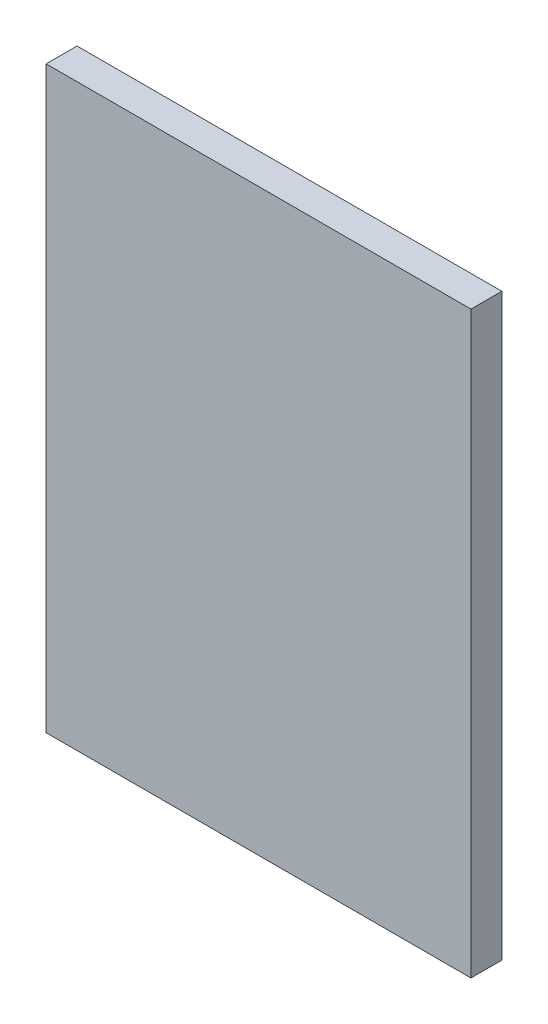
ISO-10303-21;
HEADER;
FILE_DESCRIPTION(('STEP AP214'),'2;1');
FILE_NAME('part.step','',(''),(''),'','','');
FILE_SCHEMA(('AUTOMOTIVE_DESIGN { 1 0 10303 214 1 1 1 1 }'));
ENDSEC;
DATA;
#1=APPLICATION_CONTEXT('core data for automotive mechanical design processes');
#2=APPLICATION_PROTOCOL_DEFINITION('international standard','automotive_design',2000,#1);
#3=PRODUCT_CONTEXT('',#1,'mechanical');
#4=PRODUCT('Part','Part','',(#3));
#5=PRODUCT_RELATED_PRODUCT_CATEGORY('part','',(#4));
#6=PRODUCT_DEFINITION_FORMATION('','',#4);
#7=PRODUCT_DEFINITION_CONTEXT('part definition',#1,'design');
#8=PRODUCT_DEFINITION('design','',#6,#7);
#9=PRODUCT_DEFINITION_SHAPE('','',#8);
#10=(LENGTH_UNIT() NAMED_UNIT(*) SI_UNIT(.MILLI.,.METRE.));
#11=(NAMED_UNIT(*) PLANE_ANGLE_UNIT() SI_UNIT($,.RADIAN.));
#12=(NAMED_UNIT(*) SI_UNIT($,.STERADIAN.) SOLID_ANGLE_UNIT());
#13=UNCERTAINTY_MEASURE_WITH_UNIT(LENGTH_MEASURE(1.E-05),#10,'distance_accuracy_value','');
#14=(GEOMETRIC_REPRESENTATION_CONTEXT(3) GLOBAL_UNCERTAINTY_ASSIGNED_CONTEXT((#13)) GLOBAL_UNIT_ASSIGNED_CONTEXT((#10,
#11,#12)) REPRESENTATION_CONTEXT('',''));
#15=CARTESIAN_POINT('',(0.,0.,0.));
#16=DIRECTION('',(0.,0.,1.));
#17=DIRECTION('',(1.,0.,0.));
#18=AXIS2_PLACEMENT_3D('',#15,#16,#17);
#19=CARTESIAN_POINT('',(0.,0.,8.));
#20=DIRECTION('',(1.,0.,0.));
#21=DIRECTION('',(0.,0.,-1.));
#22=AXIS2_PLACEMENT_3D('',#19,#20,#21);
#23=PLANE('',#22);
#24=DIRECTION('',(0.,-1.,0.));
#25=VECTOR('',#24,1.);
#26=CARTESIAN_POINT('',(0.,0.,0.));
#27=LINE('',#26,#25);
#28=CARTESIAN_POINT('',(0.,150.,0.));
#29=VERTEX_POINT('',#28);
#30=CARTESIAN_POINT('',(0.,0.,0.));
#31=VERTEX_POINT('',#30);
#32=EDGE_CURVE('E98',#29,#31,#27,.T.);
#33=ORIENTED_EDGE('',*,*,#32,.T.);
#34=DIRECTION('',(0.,0.,-1.));
#35=VECTOR('',#34,1.);
#36=CARTESIAN_POINT('',(0.,0.,8.));
#37=LINE('',#36,#35);
#38=CARTESIAN_POINT('',(0.,0.,8.));
#39=VERTEX_POINT('',#38);
#40=EDGE_CURVE('E11',#39,#31,#37,.T.);
#41=ORIENTED_EDGE('',*,*,#40,.F.);
#42=DIRECTION('',(0.,-1.,0.));
#43=VECTOR('',#42,1.);
#44=CARTESIAN_POINT('',(0.,0.,8.));
#45=LINE('',#44,#43);
#46=CARTESIAN_POINT('',(0.,150.,8.));
#47=VERTEX_POINT('',#46);
#48=EDGE_CURVE('E86',#47,#39,#45,.T.);
#49=ORIENTED_EDGE('',*,*,#48,.F.);
#50=DIRECTION('',(0.,0.,-1.));
#51=VECTOR('',#50,1.);
#52=CARTESIAN_POINT('',(0.,150.,8.));
#53=LINE('',#52,#51);
#54=EDGE_CURVE('E94',#47,#29,#53,.T.);
#55=ORIENTED_EDGE('',*,*,#54,.T.);
#56=EDGE_LOOP('',(#33,#41,#49,#55));
#57=FACE_BOUND('',#56,.T.);
#58=ADVANCED_FACE('F35',(#57),#23,.F.);
#59=CARTESIAN_POINT('',(0.,0.,8.));
#60=DIRECTION('',(0.,1.,0.));
#61=DIRECTION('',(0.,0.,1.));
#62=AXIS2_PLACEMENT_3D('',#59,#60,#61);
#63=PLANE('',#62);
#64=DIRECTION('',(1.,0.,0.));
#65=VECTOR('',#64,1.);
#66=CARTESIAN_POINT('',(0.,0.,0.));
#67=LINE('',#66,#65);
#68=CARTESIAN_POINT('',(110.,0.,0.));
#69=VERTEX_POINT('',#68);
#70=EDGE_CURVE('E90',#31,#69,#67,.T.);
#71=ORIENTED_EDGE('',*,*,#70,.T.);
#72=DIRECTION('',(0.,0.,-1.));
#73=VECTOR('',#72,1.);
#74=CARTESIAN_POINT('',(110.,0.,8.));
#75=LINE('',#74,#73);
#76=CARTESIAN_POINT('',(110.,0.,8.));
#77=VERTEX_POINT('',#76);
#78=EDGE_CURVE('E43',#77,#69,#75,.T.);
#79=ORIENTED_EDGE('',*,*,#78,.F.);
#80=DIRECTION('',(1.,0.,0.));
#81=VECTOR('',#80,1.);
#82=CARTESIAN_POINT('',(0.,0.,8.));
#83=LINE('',#82,#81);
#84=EDGE_CURVE('E81',#39,#77,#83,.T.);
#85=ORIENTED_EDGE('',*,*,#84,.F.);
#86=ORIENTED_EDGE('',*,*,#40,.T.);
#87=EDGE_LOOP('',(#71,#79,#85,#86));
#88=FACE_BOUND('',#87,.T.);
#89=ADVANCED_FACE('F89',(#88),#63,.F.);
#90=CARTESIAN_POINT('',(110.,0.,8.));
#91=DIRECTION('',(-1.,0.,0.));
#92=DIRECTION('',(0.,0.,1.));
#93=AXIS2_PLACEMENT_3D('',#90,#91,#92);
#94=PLANE('',#93);
#95=DIRECTION('',(0.,1.,0.));
#96=VECTOR('',#95,1.);
#97=CARTESIAN_POINT('',(110.,0.,0.));
#98=LINE('',#97,#96);
#99=CARTESIAN_POINT('',(110.,150.,0.));
#100=VERTEX_POINT('',#99);
#101=EDGE_CURVE('E68',#69,#100,#98,.T.);
#102=ORIENTED_EDGE('',*,*,#101,.T.);
#103=DIRECTION('',(0.,0.,-1.));
#104=VECTOR('',#103,1.);
#105=CARTESIAN_POINT('',(110.,150.,8.));
#106=LINE('',#105,#104);
#107=CARTESIAN_POINT('',(110.,150.,8.));
#108=VERTEX_POINT('',#107);
#109=EDGE_CURVE('E91',#108,#100,#106,.T.);
#110=ORIENTED_EDGE('',*,*,#109,.F.);
#111=DIRECTION('',(0.,1.,0.));
#112=VECTOR('',#111,1.);
#113=CARTESIAN_POINT('',(110.,0.,8.));
#114=LINE('',#113,#112);
#115=EDGE_CURVE('E84',#77,#108,#114,.T.);
#116=ORIENTED_EDGE('',*,*,#115,.F.);
#117=ORIENTED_EDGE('',*,*,#78,.T.);
#118=EDGE_LOOP('',(#102,#110,#116,#117));
#119=FACE_BOUND('',#118,.T.);
#120=ADVANCED_FACE('F92',(#119),#94,.F.);
#121=CARTESIAN_POINT('',(0.,150.,8.));
#122=DIRECTION('',(0.,-1.,0.));
#123=DIRECTION('',(0.,0.,-1.));
#124=AXIS2_PLACEMENT_3D('',#121,#122,#123);
#125=PLANE('',#124);
#126=DIRECTION('',(-1.,0.,0.));
#127=VECTOR('',#126,1.);
#128=CARTESIAN_POINT('',(0.,150.,0.));
#129=LINE('',#128,#127);
#130=EDGE_CURVE('E74',#100,#29,#129,.T.);
#131=ORIENTED_EDGE('',*,*,#130,.T.);
#132=ORIENTED_EDGE('',*,*,#54,.F.);
#133=DIRECTION('',(-1.,0.,0.));
#134=VECTOR('',#133,1.);
#135=CARTESIAN_POINT('',(0.,150.,8.));
#136=LINE('',#135,#134);
#137=EDGE_CURVE('E51',#108,#47,#136,.T.);
#138=ORIENTED_EDGE('',*,*,#137,.F.);
#139=ORIENTED_EDGE('',*,*,#109,.T.);
#140=EDGE_LOOP('',(#131,#132,#138,#139));
#141=FACE_BOUND('',#140,.T.);
#142=ADVANCED_FACE('F105',(#141),#125,.F.);
#143=CARTESIAN_POINT('',(0.,0.,8.));
#144=DIRECTION('',(0.,0.,-1.));
#145=DIRECTION('',(-1.,0.,0.));
#146=AXIS2_PLACEMENT_3D('',#143,#144,#145);
#147=PLANE('',#146);
#148=ORIENTED_EDGE('',*,*,#48,.T.);
#149=ORIENTED_EDGE('',*,*,#84,.T.);
#150=ORIENTED_EDGE('',*,*,#115,.T.);
#151=ORIENTED_EDGE('',*,*,#137,.T.);
#152=EDGE_LOOP('',(#148,#149,#150,#151));
#153=FACE_BOUND('',#152,.T.);
#154=ADVANCED_FACE('F82',(#153),#147,.F.);
#155=CARTESIAN_POINT('',(0.,0.,0.));
#156=DIRECTION('',(0.,0.,-1.));
#157=DIRECTION('',(-1.,0.,0.));
#158=AXIS2_PLACEMENT_3D('',#155,#156,#157);
#159=PLANE('',#158);
#160=ORIENTED_EDGE('',*,*,#32,.F.);
#161=ORIENTED_EDGE('',*,*,#130,.F.);
#162=ORIENTED_EDGE('',*,*,#101,.F.);
#163=ORIENTED_EDGE('',*,*,#70,.F.);
#164=EDGE_LOOP('',(#160,#161,#162,#163));
#165=FACE_BOUND('',#164,.T.);
#166=ADVANCED_FACE('F108',(#165),#159,.T.);
#167=CLOSED_SHELL('',(#58,#89,#120,#142,#154,#166));
#168=MANIFOLD_SOLID_BREP('B2',#167);
#169=ADVANCED_BREP_SHAPE_REPRESENTATION('',(#18,#168),#14);
#170=SHAPE_DEFINITION_REPRESENTATION(#9,#169);
ENDSEC;
END-ISO-10303-21;
